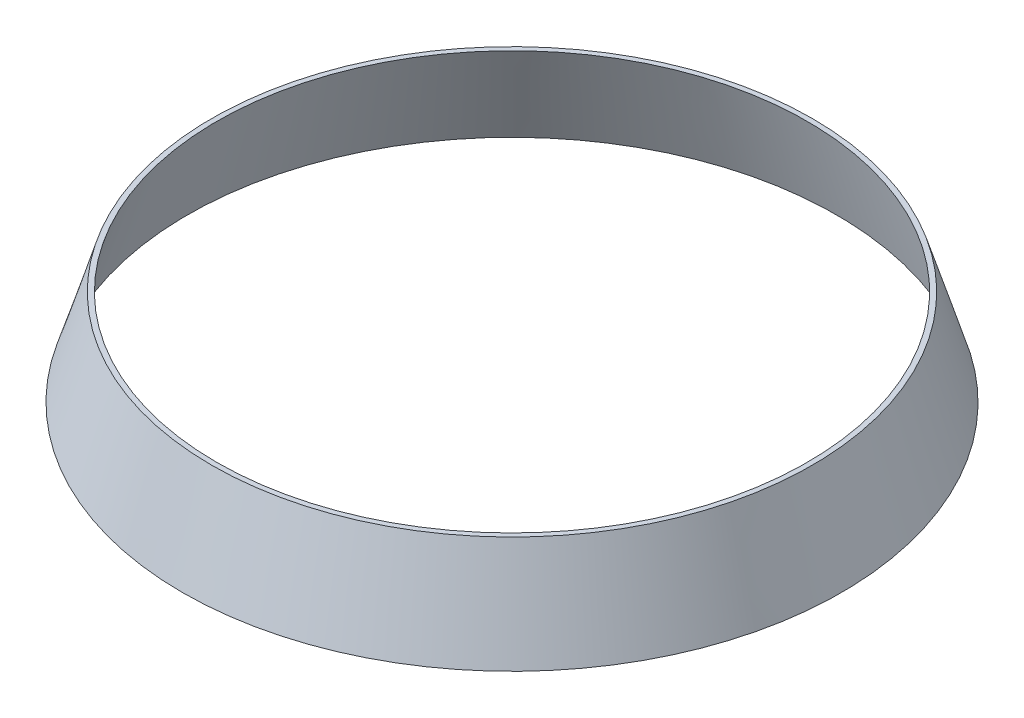
ISO-10303-21;
HEADER;
FILE_DESCRIPTION(('STEP AP214'),'2;1');
FILE_NAME('part.step','',(''),(''),'','','');
FILE_SCHEMA(('AUTOMOTIVE_DESIGN { 1 0 10303 214 1 1 1 1 }'));
ENDSEC;
DATA;
#1=APPLICATION_CONTEXT('core data for automotive mechanical design processes');
#2=APPLICATION_PROTOCOL_DEFINITION('international standard','automotive_design',2000,#1);
#3=PRODUCT_CONTEXT('',#1,'mechanical');
#4=PRODUCT('Part','Part','',(#3));
#5=PRODUCT_RELATED_PRODUCT_CATEGORY('part','',(#4));
#6=PRODUCT_DEFINITION_FORMATION('','',#4);
#7=PRODUCT_DEFINITION_CONTEXT('part definition',#1,'design');
#8=PRODUCT_DEFINITION('design','',#6,#7);
#9=PRODUCT_DEFINITION_SHAPE('','',#8);
#10=(LENGTH_UNIT() NAMED_UNIT(*) SI_UNIT(.MILLI.,.METRE.));
#11=(NAMED_UNIT(*) PLANE_ANGLE_UNIT() SI_UNIT($,.RADIAN.));
#12=(NAMED_UNIT(*) SI_UNIT($,.STERADIAN.) SOLID_ANGLE_UNIT());
#13=UNCERTAINTY_MEASURE_WITH_UNIT(LENGTH_MEASURE(1.E-05),#10,'distance_accuracy_value','');
#14=(GEOMETRIC_REPRESENTATION_CONTEXT(3) GLOBAL_UNCERTAINTY_ASSIGNED_CONTEXT((#13)) GLOBAL_UNIT_ASSIGNED_CONTEXT((#10,
#11,#12)) REPRESENTATION_CONTEXT('',''));
#15=CARTESIAN_POINT('',(0.,0.,0.));
#16=DIRECTION('',(0.,0.,1.));
#17=DIRECTION('',(1.,0.,0.));
#18=AXIS2_PLACEMENT_3D('',#15,#16,#17);
#19=CARTESIAN_POINT('',(0.,0.,0.));
#20=DIRECTION('',(0.,-1.,0.));
#21=DIRECTION('',(0.,0.,-1.));
#22=AXIS2_PLACEMENT_3D('',#19,#20,#21);
#23=PLANE('',#22);
#24=CARTESIAN_POINT('',(67.8646136291731,0.,0.));
#25=DIRECTION('',(0.,-1.,0.));
#26=DIRECTION('',(0.,0.,-1.));
#27=AXIS2_PLACEMENT_3D('',#24,#25,#26);
#28=CIRCLE('',#27,68.9103053856603);
#29=CARTESIAN_POINT('',(67.8646136291731,0.,-68.9103053856603));
#30=VERTEX_POINT('',#29);
#31=EDGE_CURVE('E10',#30,#30,#28,.F.);
#32=ORIENTED_EDGE('',*,*,#31,.F.);
#33=EDGE_LOOP('',(#32));
#34=FACE_BOUND('',#33,.T.);
#35=CARTESIAN_POINT('',(67.8646136291731,0.,0.));
#36=DIRECTION('',(0.,1.,0.));
#37=DIRECTION('',(0.,0.,1.));
#38=AXIS2_PLACEMENT_3D('',#35,#36,#37);
#39=CIRCLE('',#38,67.8646136291731);
#40=CARTESIAN_POINT('',(67.8646136291731,0.,67.8646136291731));
#41=VERTEX_POINT('',#40);
#42=EDGE_CURVE('E44',#41,#41,#39,.T.);
#43=ORIENTED_EDGE('',*,*,#42,.T.);
#44=EDGE_LOOP('',(#43));
#45=FACE_BOUND('',#44,.T.);
#46=ADVANCED_FACE('F33',(#34,#45),#23,.T.);
#47=CARTESIAN_POINT('',(67.8646136291731,20.2923717047227,0.));
#48=DIRECTION('',(0.,-1.,0.));
#49=DIRECTION('',(0.,0.,-1.));
#50=AXIS2_PLACEMENT_3D('',#47,#48,#49);
#51=CONICAL_SURFACE('',#50,62.706304755963,0.296705972839034);
#52=ORIENTED_EDGE('',*,*,#31,.T.);
#53=EDGE_LOOP('',(#52));
#54=FACE_BOUND('',#53,.T.);
#55=CARTESIAN_POINT('',(67.8646136291731,20.,0.));
#56=DIRECTION('',(0.,1.,0.));
#57=DIRECTION('',(0.,0.,1.));
#58=AXIS2_PLACEMENT_3D('',#55,#56,#57);
#59=CIRCLE('',#58,62.7956917564871);
#60=CARTESIAN_POINT('',(67.8646136291731,20.,62.7956917564871));
#61=VERTEX_POINT('',#60);
#62=EDGE_CURVE('E37',#61,#61,#59,.T.);
#63=ORIENTED_EDGE('',*,*,#62,.F.);
#64=EDGE_LOOP('',(#63));
#65=FACE_BOUND('',#64,.T.);
#66=ADVANCED_FACE('F35',(#54,#65),#51,.T.);
#67=CARTESIAN_POINT('',(6.11461362917315,20.,0.));
#68=DIRECTION('',(0.,1.,0.));
#69=DIRECTION('',(0.,0.,1.));
#70=AXIS2_PLACEMENT_3D('',#67,#68,#69);
#71=PLANE('',#70);
#72=CARTESIAN_POINT('',(67.8646136291731,20.,0.));
#73=DIRECTION('',(0.,1.,0.));
#74=DIRECTION('',(0.,0.,1.));
#75=AXIS2_PLACEMENT_3D('',#72,#73,#74);
#76=CIRCLE('',#75,61.75);
#77=CARTESIAN_POINT('',(67.8646136291731,20.,61.75));
#78=VERTEX_POINT('',#77);
#79=EDGE_CURVE('E48',#78,#78,#76,.T.);
#80=ORIENTED_EDGE('',*,*,#79,.F.);
#81=EDGE_LOOP('',(#80));
#82=FACE_BOUND('',#81,.T.);
#83=ORIENTED_EDGE('',*,*,#62,.T.);
#84=EDGE_LOOP('',(#83));
#85=FACE_BOUND('',#84,.T.);
#86=ADVANCED_FACE('F54',(#82,#85),#71,.T.);
#87=CARTESIAN_POINT('',(67.8646136291731,20.,0.));
#88=DIRECTION('',(0.,-1.,0.));
#89=DIRECTION('',(0.,0.,-1.));
#90=AXIS2_PLACEMENT_3D('',#87,#88,#89);
#91=CONICAL_SURFACE('',#90,61.75,0.296705972839034);
#92=ORIENTED_EDGE('',*,*,#42,.F.);
#93=EDGE_LOOP('',(#92));
#94=FACE_BOUND('',#93,.T.);
#95=ORIENTED_EDGE('',*,*,#79,.T.);
#96=EDGE_LOOP('',(#95));
#97=FACE_BOUND('',#96,.T.);
#98=ADVANCED_FACE('F52',(#94,#97),#91,.F.);
#99=CLOSED_SHELL('',(#46,#66,#86,#98));
#100=MANIFOLD_SOLID_BREP('B2',#99);
#101=ADVANCED_BREP_SHAPE_REPRESENTATION('',(#18,#100),#14);
#102=SHAPE_DEFINITION_REPRESENTATION(#9,#101);
ENDSEC;
END-ISO-10303-21;
